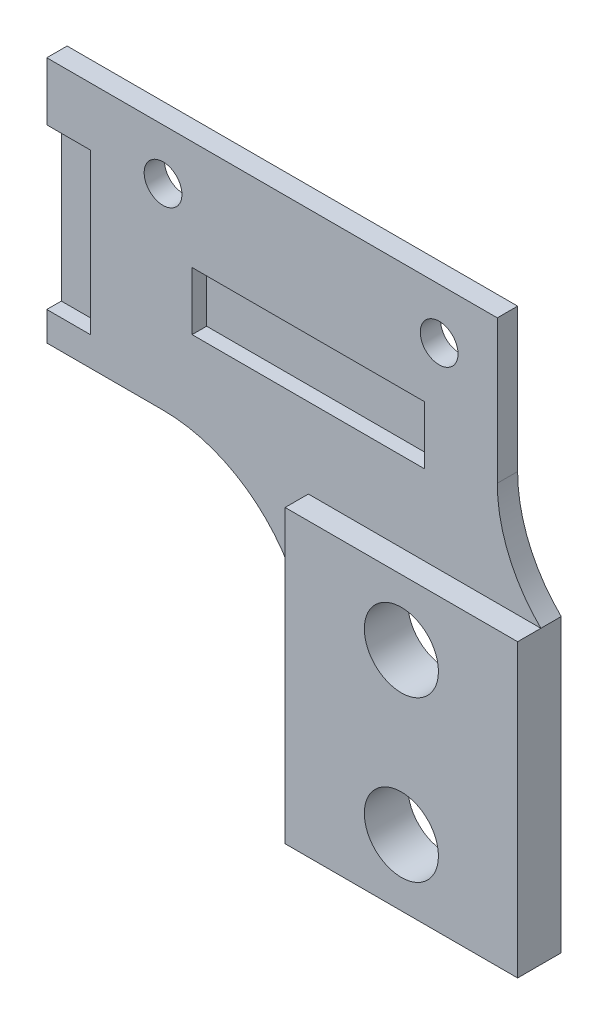
ISO-10303-21;
HEADER;
FILE_DESCRIPTION(('STEP AP214'),'2;1');
FILE_NAME('part.step','',(''),(''),'','','');
FILE_SCHEMA(('AUTOMOTIVE_DESIGN { 1 0 10303 214 1 1 1 1 }'));
ENDSEC;
DATA;
#1=APPLICATION_CONTEXT('core data for automotive mechanical design processes');
#2=APPLICATION_PROTOCOL_DEFINITION('international standard','automotive_design',2000,#1);
#3=PRODUCT_CONTEXT('',#1,'mechanical');
#4=PRODUCT('Part','Part','',(#3));
#5=PRODUCT_RELATED_PRODUCT_CATEGORY('part','',(#4));
#6=PRODUCT_DEFINITION_FORMATION('','',#4);
#7=PRODUCT_DEFINITION_CONTEXT('part definition',#1,'design');
#8=PRODUCT_DEFINITION('design','',#6,#7);
#9=PRODUCT_DEFINITION_SHAPE('','',#8);
#10=(LENGTH_UNIT() NAMED_UNIT(*) SI_UNIT(.MILLI.,.METRE.));
#11=(NAMED_UNIT(*) PLANE_ANGLE_UNIT() SI_UNIT($,.RADIAN.));
#12=(NAMED_UNIT(*) SI_UNIT($,.STERADIAN.) SOLID_ANGLE_UNIT());
#13=UNCERTAINTY_MEASURE_WITH_UNIT(LENGTH_MEASURE(1.E-05),#10,'distance_accuracy_value','');
#14=(GEOMETRIC_REPRESENTATION_CONTEXT(3) GLOBAL_UNCERTAINTY_ASSIGNED_CONTEXT((#13)) GLOBAL_UNIT_ASSIGNED_CONTEXT((#10,
#11,#12)) REPRESENTATION_CONTEXT('',''));
#15=CARTESIAN_POINT('',(0.,0.,0.));
#16=DIRECTION('',(0.,0.,1.));
#17=DIRECTION('',(1.,0.,0.));
#18=AXIS2_PLACEMENT_3D('',#15,#16,#17);
#19=CARTESIAN_POINT('',(-20.,-8.5,1.4));
#20=DIRECTION('',(0.,1.,0.));
#21=DIRECTION('',(0.,0.,1.));
#22=AXIS2_PLACEMENT_3D('',#19,#20,#21);
#23=PLANE('',#22);
#24=DIRECTION('',(1.,0.,0.));
#25=VECTOR('',#24,1.);
#26=CARTESIAN_POINT('',(-20.,-8.5,0.));
#27=LINE('',#26,#25);
#28=CARTESIAN_POINT('',(-11.,-8.5,0.));
#29=VERTEX_POINT('',#28);
#30=CARTESIAN_POINT('',(-2.99999999999997,-8.5,0.));
#31=VERTEX_POINT('',#30);
#32=EDGE_CURVE('E278',#29,#31,#27,.T.);
#33=ORIENTED_EDGE('',*,*,#32,.T.);
#34=DIRECTION('',(0.,0.,-1.));
#35=VECTOR('',#34,1.);
#36=CARTESIAN_POINT('',(-2.99999999999997,-8.5,1.4));
#37=LINE('',#36,#35);
#38=CARTESIAN_POINT('',(-2.99999999999997,-8.5,1.4));
#39=VERTEX_POINT('',#38);
#40=EDGE_CURVE('E299',#31,#39,#37,.F.);
#41=ORIENTED_EDGE('',*,*,#40,.T.);
#42=DIRECTION('',(1.,0.,0.));
#43=VECTOR('',#42,1.);
#44=CARTESIAN_POINT('',(-20.,-8.5,1.4));
#45=LINE('',#44,#43);
#46=CARTESIAN_POINT('',(-11.,-8.5,1.4));
#47=VERTEX_POINT('',#46);
#48=EDGE_CURVE('E282',#47,#39,#45,.T.);
#49=ORIENTED_EDGE('',*,*,#48,.F.);
#50=DIRECTION('',(0.,0.,-1.));
#51=VECTOR('',#50,1.);
#52=CARTESIAN_POINT('',(-11.,-8.5,21.));
#53=LINE('',#52,#51);
#54=EDGE_CURVE('E194',#47,#29,#53,.T.);
#55=ORIENTED_EDGE('',*,*,#54,.T.);
#56=EDGE_LOOP('',(#33,#41,#49,#55));
#57=FACE_BOUND('',#56,.T.);
#58=ADVANCED_FACE('F32',(#57),#23,.F.);
#59=CARTESIAN_POINT('',(-20.,8.5,1.4));
#60=DIRECTION('',(0.,-1.,0.));
#61=DIRECTION('',(0.,0.,-1.));
#62=AXIS2_PLACEMENT_3D('',#59,#60,#61);
#63=PLANE('',#62);
#64=DIRECTION('',(0.,0.,-1.));
#65=VECTOR('',#64,1.);
#66=CARTESIAN_POINT('',(-11.,8.5,21.));
#67=LINE('',#66,#65);
#68=CARTESIAN_POINT('',(-11.,8.5,1.4));
#69=VERTEX_POINT('',#68);
#70=CARTESIAN_POINT('',(-11.,8.5,0.));
#71=VERTEX_POINT('',#70);
#72=EDGE_CURVE('E187',#69,#71,#67,.T.);
#73=ORIENTED_EDGE('',*,*,#72,.F.);
#74=DIRECTION('',(-1.,0.,0.));
#75=VECTOR('',#74,1.);
#76=CARTESIAN_POINT('',(-20.,8.5,1.4));
#77=LINE('',#76,#75);
#78=CARTESIAN_POINT('',(20.,8.5,1.4));
#79=VERTEX_POINT('',#78);
#80=EDGE_CURVE('E277',#79,#69,#77,.T.);
#81=ORIENTED_EDGE('',*,*,#80,.F.);
#82=DIRECTION('',(0.,0.,-1.));
#83=VECTOR('',#82,1.);
#84=CARTESIAN_POINT('',(20.,8.5,1.4));
#85=LINE('',#84,#83);
#86=CARTESIAN_POINT('',(20.,8.5,0.));
#87=VERTEX_POINT('',#86);
#88=EDGE_CURVE('E285',#79,#87,#85,.T.);
#89=ORIENTED_EDGE('',*,*,#88,.T.);
#90=DIRECTION('',(-1.,0.,0.));
#91=VECTOR('',#90,1.);
#92=CARTESIAN_POINT('',(-20.,8.5,0.));
#93=LINE('',#92,#91);
#94=EDGE_CURVE('E287',#87,#71,#93,.T.);
#95=ORIENTED_EDGE('',*,*,#94,.T.);
#96=EDGE_LOOP('',(#73,#81,#89,#95));
#97=FACE_BOUND('',#96,.T.);
#98=ADVANCED_FACE('F372',(#97),#63,.F.);
#99=CARTESIAN_POINT('',(0.,0.,1.4));
#100=DIRECTION('',(0.,0.,-1.));
#101=DIRECTION('',(-1.,0.,0.));
#102=AXIS2_PLACEMENT_3D('',#99,#100,#101);
#103=PLANE('',#102);
#104=DIRECTION('',(0.,-1.,0.));
#105=VECTOR('',#104,1.);
#106=CARTESIAN_POINT('',(-0.999999999999977,0.,1.4));
#107=LINE('',#106,#105);
#108=CARTESIAN_POINT('',(-0.999999999999977,0.999999999999996,1.4));
#109=VERTEX_POINT('',#108);
#110=CARTESIAN_POINT('',(-0.999999999999977,-3.,1.4));
#111=VERTEX_POINT('',#110);
#112=EDGE_CURVE('E229',#109,#111,#107,.T.);
#113=ORIENTED_EDGE('',*,*,#112,.F.);
#114=DIRECTION('',(-1.,0.,0.));
#115=VECTOR('',#114,1.);
#116=CARTESIAN_POINT('',(0.,0.999999999999996,1.4));
#117=LINE('',#116,#115);
#118=CARTESIAN_POINT('',(15.,0.999999999999996,1.4));
#119=VERTEX_POINT('',#118);
#120=EDGE_CURVE('E227',#119,#109,#117,.T.);
#121=ORIENTED_EDGE('',*,*,#120,.F.);
#122=DIRECTION('',(0.,1.,0.));
#123=VECTOR('',#122,1.);
#124=CARTESIAN_POINT('',(15.,0.,1.4));
#125=LINE('',#124,#123);
#126=CARTESIAN_POINT('',(15.,-3.,1.4));
#127=VERTEX_POINT('',#126);
#128=EDGE_CURVE('E217',#127,#119,#125,.T.);
#129=ORIENTED_EDGE('',*,*,#128,.F.);
#130=DIRECTION('',(1.,0.,0.));
#131=VECTOR('',#130,1.);
#132=CARTESIAN_POINT('',(0.,-3.,1.4));
#133=LINE('',#132,#131);
#134=EDGE_CURVE('E233',#111,#127,#133,.T.);
#135=ORIENTED_EDGE('',*,*,#134,.F.);
#136=EDGE_LOOP('',(#113,#121,#129,#135));
#137=FACE_BOUND('',#136,.T.);
#138=CARTESIAN_POINT('',(-2.99999999999997,5.,1.4));
#139=DIRECTION('',(0.,0.,-1.));
#140=DIRECTION('',(-1.,0.,0.));
#141=AXIS2_PLACEMENT_3D('',#138,#139,#140);
#142=CIRCLE('',#141,1.3);
#143=CARTESIAN_POINT('',(-4.29999999999997,5.,1.4));
#144=VERTEX_POINT('',#143);
#145=EDGE_CURVE('E203',#144,#144,#142,.F.);
#146=ORIENTED_EDGE('',*,*,#145,.F.);
#147=EDGE_LOOP('',(#146));
#148=FACE_BOUND('',#147,.T.);
#149=CARTESIAN_POINT('',(16.,5.,1.4));
#150=DIRECTION('',(0.,0.,-1.));
#151=DIRECTION('',(-1.,0.,0.));
#152=AXIS2_PLACEMENT_3D('',#149,#150,#151);
#153=CIRCLE('',#152,1.3);
#154=CARTESIAN_POINT('',(14.7,5.,1.4));
#155=VERTEX_POINT('',#154);
#156=EDGE_CURVE('E209',#155,#155,#153,.F.);
#157=ORIENTED_EDGE('',*,*,#156,.F.);
#158=EDGE_LOOP('',(#157));
#159=FACE_BOUND('',#158,.T.);
#160=DIRECTION('',(0.,1.,0.));
#161=VECTOR('',#160,1.);
#162=CARTESIAN_POINT('',(-11.,0.,1.4));
#163=LINE('',#162,#161);
#164=CARTESIAN_POINT('',(-11.,-6.5,1.4));
#165=VERTEX_POINT('',#164);
#166=EDGE_CURVE('E199',#47,#165,#163,.T.);
#167=ORIENTED_EDGE('',*,*,#166,.F.);
#168=ORIENTED_EDGE('',*,*,#48,.T.);
#169=CARTESIAN_POINT('',(-2.99999999999997,-18.5,1.4));
#170=DIRECTION('',(0.,0.,-1.));
#171=DIRECTION('',(-1.,0.,0.));
#172=AXIS2_PLACEMENT_3D('',#169,#170,#171);
#173=CIRCLE('',#172,10.);
#174=CARTESIAN_POINT('',(7.00000000000003,-18.5,1.4));
#175=VERTEX_POINT('',#174);
#176=EDGE_CURVE('E11',#39,#175,#173,.T.);
#177=ORIENTED_EDGE('',*,*,#176,.T.);
#178=DIRECTION('',(0.,-1.,0.));
#179=VECTOR('',#178,1.);
#180=CARTESIAN_POINT('',(7.00000000000003,0.,1.4));
#181=LINE('',#180,#179);
#182=CARTESIAN_POINT('',(7.00000000000003,-8.5,1.4));
#183=VERTEX_POINT('',#182);
#184=EDGE_CURVE('E46',#183,#175,#181,.T.);
#185=ORIENTED_EDGE('',*,*,#184,.F.);
#186=CARTESIAN_POINT('',(23.,-8.5,1.4));
#187=VERTEX_POINT('',#186);
#188=EDGE_CURVE('E281',#183,#187,#45,.T.);
#189=ORIENTED_EDGE('',*,*,#188,.T.);
#190=CARTESIAN_POINT('',(30.,-1.35857157145716,1.4));
#191=DIRECTION('',(0.,0.,-1.));
#192=DIRECTION('',(-1.,0.,0.));
#193=AXIS2_PLACEMENT_3D('',#190,#191,#192);
#194=CIRCLE('',#193,10.);
#195=CARTESIAN_POINT('',(20.,-1.35857157145716,1.4));
#196=VERTEX_POINT('',#195);
#197=EDGE_CURVE('E303',#187,#196,#194,.T.);
#198=ORIENTED_EDGE('',*,*,#197,.T.);
#199=DIRECTION('',(0.,1.,0.));
#200=VECTOR('',#199,1.);
#201=CARTESIAN_POINT('',(20.,-8.5,1.4));
#202=LINE('',#201,#200);
#203=EDGE_CURVE('E275',#196,#79,#202,.T.);
#204=ORIENTED_EDGE('',*,*,#203,.T.);
#205=ORIENTED_EDGE('',*,*,#80,.T.);
#206=CARTESIAN_POINT('',(-11.,4.5,1.4));
#207=VERTEX_POINT('',#206);
#208=EDGE_CURVE('E197',#207,#69,#163,.T.);
#209=ORIENTED_EDGE('',*,*,#208,.F.);
#210=DIRECTION('',(-1.,0.,0.));
#211=VECTOR('',#210,1.);
#212=CARTESIAN_POINT('',(0.,4.5,1.4));
#213=LINE('',#212,#211);
#214=CARTESIAN_POINT('',(-7.99999999999998,4.5,1.4));
#215=VERTEX_POINT('',#214);
#216=EDGE_CURVE('E262',#215,#207,#213,.T.);
#217=ORIENTED_EDGE('',*,*,#216,.F.);
#218=DIRECTION('',(0.,1.,0.));
#219=VECTOR('',#218,1.);
#220=CARTESIAN_POINT('',(-7.99999999999998,0.,1.4));
#221=LINE('',#220,#219);
#222=CARTESIAN_POINT('',(-7.99999999999998,-6.5,1.4));
#223=VERTEX_POINT('',#222);
#224=EDGE_CURVE('E212',#223,#215,#221,.T.);
#225=ORIENTED_EDGE('',*,*,#224,.F.);
#226=DIRECTION('',(1.,0.,0.));
#227=VECTOR('',#226,1.);
#228=CARTESIAN_POINT('',(0.,-6.5,1.4));
#229=LINE('',#228,#227);
#230=EDGE_CURVE('E251',#165,#223,#229,.T.);
#231=ORIENTED_EDGE('',*,*,#230,.F.);
#232=EDGE_LOOP('',(#167,#168,#177,#185,#189,#198,#204,#205,#209,#217,#225,#231));
#233=FACE_BOUND('',#232,.T.);
#234=ADVANCED_FACE('F307',(#137,#148,#159,#233),#103,.F.);
#235=CARTESIAN_POINT('',(0.,0.,0.));
#236=DIRECTION('',(0.,0.,-1.));
#237=DIRECTION('',(-1.,0.,0.));
#238=AXIS2_PLACEMENT_3D('',#235,#236,#237);
#239=PLANE('',#238);
#240=CARTESIAN_POINT('',(16.,5.,0.));
#241=DIRECTION('',(0.,0.,1.));
#242=DIRECTION('',(1.,0.,0.));
#243=AXIS2_PLACEMENT_3D('',#240,#241,#242);
#244=CIRCLE('',#243,1.3);
#245=CARTESIAN_POINT('',(17.3,5.,0.));
#246=VERTEX_POINT('',#245);
#247=EDGE_CURVE('E200',#246,#246,#244,.T.);
#248=ORIENTED_EDGE('',*,*,#247,.T.);
#249=EDGE_LOOP('',(#248));
#250=FACE_BOUND('',#249,.T.);
#251=CARTESIAN_POINT('',(-2.99999999999997,5.,0.));
#252=DIRECTION('',(0.,0.,1.));
#253=DIRECTION('',(1.,0.,0.));
#254=AXIS2_PLACEMENT_3D('',#251,#252,#253);
#255=CIRCLE('',#254,1.3);
#256=CARTESIAN_POINT('',(-1.69999999999997,5.,0.));
#257=VERTEX_POINT('',#256);
#258=EDGE_CURVE('E204',#257,#257,#255,.T.);
#259=ORIENTED_EDGE('',*,*,#258,.T.);
#260=EDGE_LOOP('',(#259));
#261=FACE_BOUND('',#260,.T.);
#262=ORIENTED_EDGE('',*,*,#32,.F.);
#263=DIRECTION('',(0.,1.,0.));
#264=VECTOR('',#263,1.);
#265=CARTESIAN_POINT('',(-11.,8.5,0.));
#266=LINE('',#265,#264);
#267=EDGE_CURVE('E184',#29,#71,#266,.T.);
#268=ORIENTED_EDGE('',*,*,#267,.T.);
#269=ORIENTED_EDGE('',*,*,#94,.F.);
#270=DIRECTION('',(0.,1.,0.));
#271=VECTOR('',#270,1.);
#272=CARTESIAN_POINT('',(20.,-8.5,0.));
#273=LINE('',#272,#271);
#274=CARTESIAN_POINT('',(20.,-1.35857157145716,0.));
#275=VERTEX_POINT('',#274);
#276=EDGE_CURVE('E240',#275,#87,#273,.T.);
#277=ORIENTED_EDGE('',*,*,#276,.F.);
#278=CARTESIAN_POINT('',(30.,-1.35857157145716,0.));
#279=DIRECTION('',(0.,0.,-1.));
#280=DIRECTION('',(-1.,0.,0.));
#281=AXIS2_PLACEMENT_3D('',#278,#279,#280);
#282=CIRCLE('',#281,10.);
#283=CARTESIAN_POINT('',(23.,-8.5,0.));
#284=VERTEX_POINT('',#283);
#285=EDGE_CURVE('E301',#275,#284,#282,.F.);
#286=ORIENTED_EDGE('',*,*,#285,.T.);
#287=DIRECTION('',(0.,1.,0.));
#288=VECTOR('',#287,1.);
#289=CARTESIAN_POINT('',(23.,-8.5,0.));
#290=LINE('',#289,#288);
#291=CARTESIAN_POINT('',(23.,-28.5414440640029,0.));
#292=VERTEX_POINT('',#291);
#293=EDGE_CURVE('E178',#292,#284,#290,.T.);
#294=ORIENTED_EDGE('',*,*,#293,.F.);
#295=DIRECTION('',(1.,0.,0.));
#296=VECTOR('',#295,1.);
#297=CARTESIAN_POINT('',(23.,-28.5414440640029,0.));
#298=LINE('',#297,#296);
#299=CARTESIAN_POINT('',(7.00000000000003,-28.5414440640029,0.));
#300=VERTEX_POINT('',#299);
#301=EDGE_CURVE('E329',#300,#292,#298,.T.);
#302=ORIENTED_EDGE('',*,*,#301,.F.);
#303=DIRECTION('',(0.,-1.,0.));
#304=VECTOR('',#303,1.);
#305=CARTESIAN_POINT('',(7.00000000000003,-8.49999999999999,0.));
#306=LINE('',#305,#304);
#307=CARTESIAN_POINT('',(7.00000000000003,-18.5,0.));
#308=VERTEX_POINT('',#307);
#309=EDGE_CURVE('E182',#308,#300,#306,.T.);
#310=ORIENTED_EDGE('',*,*,#309,.F.);
#311=CARTESIAN_POINT('',(-2.99999999999997,-18.5,0.));
#312=DIRECTION('',(0.,0.,-1.));
#313=DIRECTION('',(-1.,0.,0.));
#314=AXIS2_PLACEMENT_3D('',#311,#312,#313);
#315=CIRCLE('',#314,10.);
#316=EDGE_CURVE('E40',#308,#31,#315,.F.);
#317=ORIENTED_EDGE('',*,*,#316,.T.);
#318=EDGE_LOOP('',(#262,#268,#269,#277,#286,#294,#302,#310,#317));
#319=FACE_BOUND('',#318,.T.);
#320=CARTESIAN_POINT('',(15.,-13.,0.));
#321=DIRECTION('',(0.,0.,1.));
#322=DIRECTION('',(1.,0.,0.));
#323=AXIS2_PLACEMENT_3D('',#320,#321,#322);
#324=CIRCLE('',#323,2.55);
#325=CARTESIAN_POINT('',(17.55,-13.,0.));
#326=VERTEX_POINT('',#325);
#327=EDGE_CURVE('E341',#326,#326,#324,.T.);
#328=ORIENTED_EDGE('',*,*,#327,.T.);
#329=EDGE_LOOP('',(#328));
#330=FACE_BOUND('',#329,.T.);
#331=CARTESIAN_POINT('',(15.,-24.,0.));
#332=DIRECTION('',(0.,0.,1.));
#333=DIRECTION('',(1.,0.,0.));
#334=AXIS2_PLACEMENT_3D('',#331,#332,#333);
#335=CIRCLE('',#334,2.55);
#336=CARTESIAN_POINT('',(17.55,-24.,0.));
#337=VERTEX_POINT('',#336);
#338=EDGE_CURVE('E349',#337,#337,#335,.T.);
#339=ORIENTED_EDGE('',*,*,#338,.T.);
#340=EDGE_LOOP('',(#339));
#341=FACE_BOUND('',#340,.T.);
#342=ADVANCED_FACE('F322',(#250,#261,#319,#330,#341),#239,.T.);
#343=CARTESIAN_POINT('',(20.,-8.5,1.4));
#344=DIRECTION('',(-1.,0.,0.));
#345=DIRECTION('',(0.,0.,1.));
#346=AXIS2_PLACEMENT_3D('',#343,#344,#345);
#347=PLANE('',#346);
#348=ORIENTED_EDGE('',*,*,#203,.F.);
#349=DIRECTION('',(0.,0.,-1.));
#350=VECTOR('',#349,1.);
#351=CARTESIAN_POINT('',(20.,-1.35857157145716,1.4));
#352=LINE('',#351,#350);
#353=EDGE_CURVE('E293',#196,#275,#352,.T.);
#354=ORIENTED_EDGE('',*,*,#353,.T.);
#355=ORIENTED_EDGE('',*,*,#276,.T.);
#356=ORIENTED_EDGE('',*,*,#88,.F.);
#357=EDGE_LOOP('',(#348,#354,#355,#356));
#358=FACE_BOUND('',#357,.T.);
#359=ADVANCED_FACE('F316',(#358),#347,.F.);
#360=CARTESIAN_POINT('',(-7.99999999999998,0.,0.4));
#361=DIRECTION('',(1.,0.,0.));
#362=DIRECTION('',(0.,0.,-1.));
#363=AXIS2_PLACEMENT_3D('',#360,#361,#362);
#364=PLANE('',#363);
#365=ORIENTED_EDGE('',*,*,#224,.T.);
#366=DIRECTION('',(0.,0.,1.));
#367=VECTOR('',#366,1.);
#368=CARTESIAN_POINT('',(-7.99999999999998,4.5,0.4));
#369=LINE('',#368,#367);
#370=CARTESIAN_POINT('',(-7.99999999999998,4.5,0.4));
#371=VERTEX_POINT('',#370);
#372=EDGE_CURVE('E260',#371,#215,#369,.T.);
#373=ORIENTED_EDGE('',*,*,#372,.F.);
#374=DIRECTION('',(0.,1.,0.));
#375=VECTOR('',#374,1.);
#376=CARTESIAN_POINT('',(-7.99999999999998,0.,0.4));
#377=LINE('',#376,#375);
#378=CARTESIAN_POINT('',(-7.99999999999998,-6.5,0.4));
#379=VERTEX_POINT('',#378);
#380=EDGE_CURVE('E247',#379,#371,#377,.T.);
#381=ORIENTED_EDGE('',*,*,#380,.F.);
#382=DIRECTION('',(0.,0.,1.));
#383=VECTOR('',#382,1.);
#384=CARTESIAN_POINT('',(-7.99999999999998,-6.5,0.4));
#385=LINE('',#384,#383);
#386=EDGE_CURVE('E230',#379,#223,#385,.T.);
#387=ORIENTED_EDGE('',*,*,#386,.T.);
#388=EDGE_LOOP('',(#365,#373,#381,#387));
#389=FACE_BOUND('',#388,.T.);
#390=ADVANCED_FACE('F384',(#389),#364,.F.);
#391=CARTESIAN_POINT('',(0.,-6.5,0.4));
#392=DIRECTION('',(0.,-1.,0.));
#393=DIRECTION('',(0.,0.,-1.));
#394=AXIS2_PLACEMENT_3D('',#391,#392,#393);
#395=PLANE('',#394);
#396=ORIENTED_EDGE('',*,*,#230,.T.);
#397=ORIENTED_EDGE('',*,*,#386,.F.);
#398=DIRECTION('',(1.,0.,0.));
#399=VECTOR('',#398,1.);
#400=CARTESIAN_POINT('',(0.,-6.5,0.4));
#401=LINE('',#400,#399);
#402=CARTESIAN_POINT('',(-11.,-6.5,0.4));
#403=VERTEX_POINT('',#402);
#404=EDGE_CURVE('E257',#403,#379,#401,.T.);
#405=ORIENTED_EDGE('',*,*,#404,.F.);
#406=DIRECTION('',(0.,0.,1.));
#407=VECTOR('',#406,1.);
#408=CARTESIAN_POINT('',(-11.,-6.5,0.4));
#409=LINE('',#408,#407);
#410=EDGE_CURVE('E268',#403,#165,#409,.T.);
#411=ORIENTED_EDGE('',*,*,#410,.T.);
#412=EDGE_LOOP('',(#396,#397,#405,#411));
#413=FACE_BOUND('',#412,.T.);
#414=ADVANCED_FACE('F453',(#413),#395,.F.);
#415=CARTESIAN_POINT('',(0.,4.5,0.4));
#416=DIRECTION('',(0.,1.,0.));
#417=DIRECTION('',(0.,0.,1.));
#418=AXIS2_PLACEMENT_3D('',#415,#416,#417);
#419=PLANE('',#418);
#420=ORIENTED_EDGE('',*,*,#216,.T.);
#421=DIRECTION('',(0.,0.,1.));
#422=VECTOR('',#421,1.);
#423=CARTESIAN_POINT('',(-11.,4.5,0.4));
#424=LINE('',#423,#422);
#425=CARTESIAN_POINT('',(-11.,4.5,0.4));
#426=VERTEX_POINT('',#425);
#427=EDGE_CURVE('E271',#426,#207,#424,.T.);
#428=ORIENTED_EDGE('',*,*,#427,.F.);
#429=DIRECTION('',(-1.,0.,0.));
#430=VECTOR('',#429,1.);
#431=CARTESIAN_POINT('',(0.,4.5,0.4));
#432=LINE('',#431,#430);
#433=EDGE_CURVE('E250',#371,#426,#432,.T.);
#434=ORIENTED_EDGE('',*,*,#433,.F.);
#435=ORIENTED_EDGE('',*,*,#372,.T.);
#436=EDGE_LOOP('',(#420,#428,#434,#435));
#437=FACE_BOUND('',#436,.T.);
#438=ADVANCED_FACE('F451',(#437),#419,.F.);
#439=CARTESIAN_POINT('',(0.,0.,0.4));
#440=DIRECTION('',(0.,0.,1.));
#441=DIRECTION('',(1.,0.,0.));
#442=AXIS2_PLACEMENT_3D('',#439,#440,#441);
#443=PLANE('',#442);
#444=ORIENTED_EDGE('',*,*,#380,.T.);
#445=ORIENTED_EDGE('',*,*,#433,.T.);
#446=DIRECTION('',(0.,-1.,0.));
#447=VECTOR('',#446,1.);
#448=CARTESIAN_POINT('',(-11.,0.,0.4));
#449=LINE('',#448,#447);
#450=EDGE_CURVE('E254',#426,#403,#449,.T.);
#451=ORIENTED_EDGE('',*,*,#450,.T.);
#452=ORIENTED_EDGE('',*,*,#404,.T.);
#453=EDGE_LOOP('',(#444,#445,#451,#452));
#454=FACE_BOUND('',#453,.T.);
#455=ADVANCED_FACE('F447',(#454),#443,.T.);
#456=CARTESIAN_POINT('',(0.,0.999999999999996,0.4));
#457=DIRECTION('',(0.,1.,0.));
#458=DIRECTION('',(0.,0.,1.));
#459=AXIS2_PLACEMENT_3D('',#456,#457,#458);
#460=PLANE('',#459);
#461=ORIENTED_EDGE('',*,*,#120,.T.);
#462=DIRECTION('',(0.,0.,1.));
#463=VECTOR('',#462,1.);
#464=CARTESIAN_POINT('',(-0.999999999999977,0.999999999999996,0.4));
#465=LINE('',#464,#463);
#466=CARTESIAN_POINT('',(-0.999999999999977,0.999999999999996,0.4));
#467=VERTEX_POINT('',#466);
#468=EDGE_CURVE('E226',#467,#109,#465,.T.);
#469=ORIENTED_EDGE('',*,*,#468,.F.);
#470=DIRECTION('',(-1.,0.,0.));
#471=VECTOR('',#470,1.);
#472=CARTESIAN_POINT('',(0.,0.999999999999996,0.4));
#473=LINE('',#472,#471);
#474=CARTESIAN_POINT('',(15.,0.999999999999996,0.4));
#475=VERTEX_POINT('',#474);
#476=EDGE_CURVE('E213',#475,#467,#473,.T.);
#477=ORIENTED_EDGE('',*,*,#476,.F.);
#478=DIRECTION('',(0.,0.,1.));
#479=VECTOR('',#478,1.);
#480=CARTESIAN_POINT('',(15.,0.999999999999996,0.4));
#481=LINE('',#480,#479);
#482=EDGE_CURVE('E238',#475,#119,#481,.T.);
#483=ORIENTED_EDGE('',*,*,#482,.T.);
#484=EDGE_LOOP('',(#461,#469,#477,#483));
#485=FACE_BOUND('',#484,.T.);
#486=ADVANCED_FACE('F437',(#485),#460,.F.);
#487=CARTESIAN_POINT('',(15.,0.,0.4));
#488=DIRECTION('',(1.,0.,0.));
#489=DIRECTION('',(0.,0.,-1.));
#490=AXIS2_PLACEMENT_3D('',#487,#488,#489);
#491=PLANE('',#490);
#492=ORIENTED_EDGE('',*,*,#128,.T.);
#493=ORIENTED_EDGE('',*,*,#482,.F.);
#494=DIRECTION('',(0.,1.,0.));
#495=VECTOR('',#494,1.);
#496=CARTESIAN_POINT('',(15.,0.,0.4));
#497=LINE('',#496,#495);
#498=CARTESIAN_POINT('',(15.,-3.,0.4));
#499=VERTEX_POINT('',#498);
#500=EDGE_CURVE('E223',#499,#475,#497,.T.);
#501=ORIENTED_EDGE('',*,*,#500,.F.);
#502=DIRECTION('',(0.,0.,1.));
#503=VECTOR('',#502,1.);
#504=CARTESIAN_POINT('',(15.,-3.,0.4));
#505=LINE('',#504,#503);
#506=EDGE_CURVE('E241',#499,#127,#505,.T.);
#507=ORIENTED_EDGE('',*,*,#506,.T.);
#508=EDGE_LOOP('',(#492,#493,#501,#507));
#509=FACE_BOUND('',#508,.T.);
#510=ADVANCED_FACE('F433',(#509),#491,.F.);
#511=CARTESIAN_POINT('',(0.,-3.,0.4));
#512=DIRECTION('',(0.,-1.,0.));
#513=DIRECTION('',(0.,0.,-1.));
#514=AXIS2_PLACEMENT_3D('',#511,#512,#513);
#515=PLANE('',#514);
#516=ORIENTED_EDGE('',*,*,#134,.T.);
#517=ORIENTED_EDGE('',*,*,#506,.F.);
#518=DIRECTION('',(1.,0.,0.));
#519=VECTOR('',#518,1.);
#520=CARTESIAN_POINT('',(0.,-3.,0.4));
#521=LINE('',#520,#519);
#522=CARTESIAN_POINT('',(-0.999999999999977,-3.,0.4));
#523=VERTEX_POINT('',#522);
#524=EDGE_CURVE('E220',#523,#499,#521,.T.);
#525=ORIENTED_EDGE('',*,*,#524,.F.);
#526=DIRECTION('',(0.,0.,1.));
#527=VECTOR('',#526,1.);
#528=CARTESIAN_POINT('',(-0.999999999999977,-3.,0.4));
#529=LINE('',#528,#527);
#530=EDGE_CURVE('E243',#523,#111,#529,.T.);
#531=ORIENTED_EDGE('',*,*,#530,.T.);
#532=EDGE_LOOP('',(#516,#517,#525,#531));
#533=FACE_BOUND('',#532,.T.);
#534=ADVANCED_FACE('F436',(#533),#515,.F.);
#535=CARTESIAN_POINT('',(-0.999999999999977,0.,0.4));
#536=DIRECTION('',(-1.,0.,0.));
#537=DIRECTION('',(0.,-1.,0.));
#538=AXIS2_PLACEMENT_3D('',#535,#536,#537);
#539=PLANE('',#538);
#540=ORIENTED_EDGE('',*,*,#112,.T.);
#541=ORIENTED_EDGE('',*,*,#530,.F.);
#542=DIRECTION('',(0.,-1.,0.));
#543=VECTOR('',#542,1.);
#544=CARTESIAN_POINT('',(-0.999999999999977,0.,0.4));
#545=LINE('',#544,#543);
#546=EDGE_CURVE('E216',#467,#523,#545,.T.);
#547=ORIENTED_EDGE('',*,*,#546,.F.);
#548=ORIENTED_EDGE('',*,*,#468,.T.);
#549=EDGE_LOOP('',(#540,#541,#547,#548));
#550=FACE_BOUND('',#549,.T.);
#551=ADVANCED_FACE('F431',(#550),#539,.F.);
#552=CARTESIAN_POINT('',(0.,0.,0.4));
#553=DIRECTION('',(0.,0.,1.));
#554=DIRECTION('',(1.,0.,0.));
#555=AXIS2_PLACEMENT_3D('',#552,#553,#554);
#556=PLANE('',#555);
#557=ORIENTED_EDGE('',*,*,#476,.T.);
#558=ORIENTED_EDGE('',*,*,#546,.T.);
#559=ORIENTED_EDGE('',*,*,#524,.T.);
#560=ORIENTED_EDGE('',*,*,#500,.T.);
#561=EDGE_LOOP('',(#557,#558,#559,#560));
#562=FACE_BOUND('',#561,.T.);
#563=ADVANCED_FACE('F416',(#562),#556,.T.);
#564=CARTESIAN_POINT('',(-2.99999999999997,5.,11.));
#565=DIRECTION('',(0.,0.,-1.));
#566=DIRECTION('',(-1.,0.,0.));
#567=AXIS2_PLACEMENT_3D('',#564,#565,#566);
#568=CYLINDRICAL_SURFACE('',#567,1.3);
#569=ORIENTED_EDGE('',*,*,#258,.F.);
#570=EDGE_LOOP('',(#569));
#571=FACE_BOUND('',#570,.T.);
#572=ORIENTED_EDGE('',*,*,#145,.T.);
#573=EDGE_LOOP('',(#572));
#574=FACE_BOUND('',#573,.T.);
#575=ADVANCED_FACE('F413',(#571,#574),#568,.F.);
#576=CARTESIAN_POINT('',(16.,5.,11.));
#577=DIRECTION('',(0.,0.,-1.));
#578=DIRECTION('',(-1.,0.,0.));
#579=AXIS2_PLACEMENT_3D('',#576,#577,#578);
#580=CYLINDRICAL_SURFACE('',#579,1.3);
#581=ORIENTED_EDGE('',*,*,#247,.F.);
#582=EDGE_LOOP('',(#581));
#583=FACE_BOUND('',#582,.T.);
#584=ORIENTED_EDGE('',*,*,#156,.T.);
#585=EDGE_LOOP('',(#584));
#586=FACE_BOUND('',#585,.T.);
#587=ADVANCED_FACE('F366',(#583,#586),#580,.F.);
#588=CARTESIAN_POINT('',(-11.,8.5,21.));
#589=DIRECTION('',(-1.,0.,0.));
#590=DIRECTION('',(0.,0.,1.));
#591=AXIS2_PLACEMENT_3D('',#588,#589,#590);
#592=PLANE('',#591);
#593=ORIENTED_EDGE('',*,*,#166,.T.);
#594=ORIENTED_EDGE('',*,*,#410,.F.);
#595=ORIENTED_EDGE('',*,*,#450,.F.);
#596=ORIENTED_EDGE('',*,*,#427,.T.);
#597=ORIENTED_EDGE('',*,*,#208,.T.);
#598=ORIENTED_EDGE('',*,*,#72,.T.);
#599=ORIENTED_EDGE('',*,*,#267,.F.);
#600=ORIENTED_EDGE('',*,*,#54,.F.);
#601=EDGE_LOOP('',(#593,#594,#595,#596,#597,#598,#599,#600));
#602=FACE_BOUND('',#601,.T.);
#603=ADVANCED_FACE('F359',(#602),#592,.T.);
#604=CARTESIAN_POINT('',(0.,0.,3.));
#605=DIRECTION('',(0.,0.,-1.));
#606=DIRECTION('',(-1.,0.,0.));
#607=AXIS2_PLACEMENT_3D('',#604,#605,#606);
#608=PLANE('',#607);
#609=DIRECTION('',(0.,-1.,0.));
#610=VECTOR('',#609,1.);
#611=CARTESIAN_POINT('',(7.00000000000003,-8.49999999999999,3.));
#612=LINE('',#611,#610);
#613=CARTESIAN_POINT('',(7.00000000000003,-8.49999999999999,3.));
#614=VERTEX_POINT('',#613);
#615=CARTESIAN_POINT('',(7.00000000000003,-28.5414440640029,3.));
#616=VERTEX_POINT('',#615);
#617=EDGE_CURVE('E169',#614,#616,#612,.T.);
#618=ORIENTED_EDGE('',*,*,#617,.T.);
#619=DIRECTION('',(1.,0.,0.));
#620=VECTOR('',#619,1.);
#621=CARTESIAN_POINT('',(23.,-28.5414440640029,3.));
#622=LINE('',#621,#620);
#623=CARTESIAN_POINT('',(23.,-28.5414440640029,3.));
#624=VERTEX_POINT('',#623);
#625=EDGE_CURVE('E159',#616,#624,#622,.T.);
#626=ORIENTED_EDGE('',*,*,#625,.T.);
#627=DIRECTION('',(0.,1.,0.));
#628=VECTOR('',#627,1.);
#629=CARTESIAN_POINT('',(23.,-8.5,3.));
#630=LINE('',#629,#628);
#631=CARTESIAN_POINT('',(23.,-8.5,3.));
#632=VERTEX_POINT('',#631);
#633=EDGE_CURVE('E168',#624,#632,#630,.T.);
#634=ORIENTED_EDGE('',*,*,#633,.T.);
#635=DIRECTION('',(-1.,0.,0.));
#636=VECTOR('',#635,1.);
#637=CARTESIAN_POINT('',(23.,-8.5,3.));
#638=LINE('',#637,#636);
#639=EDGE_CURVE('E175',#632,#614,#638,.T.);
#640=ORIENTED_EDGE('',*,*,#639,.T.);
#641=EDGE_LOOP('',(#618,#626,#634,#640));
#642=FACE_BOUND('',#641,.T.);
#643=CARTESIAN_POINT('',(15.,-13.,3.));
#644=DIRECTION('',(0.,0.,1.));
#645=DIRECTION('',(1.,0.,0.));
#646=AXIS2_PLACEMENT_3D('',#643,#644,#645);
#647=CIRCLE('',#646,2.55);
#648=CARTESIAN_POINT('',(17.55,-13.,3.));
#649=VERTEX_POINT('',#648);
#650=EDGE_CURVE('E339',#649,#649,#647,.T.);
#651=ORIENTED_EDGE('',*,*,#650,.F.);
#652=EDGE_LOOP('',(#651));
#653=FACE_BOUND('',#652,.T.);
#654=CARTESIAN_POINT('',(15.,-24.,3.));
#655=DIRECTION('',(0.,0.,1.));
#656=DIRECTION('',(1.,0.,0.));
#657=AXIS2_PLACEMENT_3D('',#654,#655,#656);
#658=CIRCLE('',#657,2.55);
#659=CARTESIAN_POINT('',(17.55,-24.,3.));
#660=VERTEX_POINT('',#659);
#661=EDGE_CURVE('E346',#660,#660,#658,.T.);
#662=ORIENTED_EDGE('',*,*,#661,.F.);
#663=EDGE_LOOP('',(#662));
#664=FACE_BOUND('',#663,.T.);
#665=ADVANCED_FACE('F172',(#642,#653,#664),#608,.F.);
#666=CARTESIAN_POINT('',(7.00000000000003,-8.49999999999999,3.));
#667=DIRECTION('',(1.,0.,0.));
#668=DIRECTION('',(0.,1.,0.));
#669=AXIS2_PLACEMENT_3D('',#666,#667,#668);
#670=PLANE('',#669);
#671=ORIENTED_EDGE('',*,*,#184,.T.);
#672=DIRECTION('',(0.,0.,-1.));
#673=VECTOR('',#672,1.);
#674=CARTESIAN_POINT('',(7.00000000000003,-18.5,0.));
#675=LINE('',#674,#673);
#676=EDGE_CURVE('E297',#175,#308,#675,.T.);
#677=ORIENTED_EDGE('',*,*,#676,.T.);
#678=ORIENTED_EDGE('',*,*,#309,.T.);
#679=DIRECTION('',(0.,0.,-1.));
#680=VECTOR('',#679,1.);
#681=CARTESIAN_POINT('',(7.00000000000003,-28.5414440640029,3.));
#682=LINE('',#681,#680);
#683=EDGE_CURVE('E163',#616,#300,#682,.T.);
#684=ORIENTED_EDGE('',*,*,#683,.F.);
#685=ORIENTED_EDGE('',*,*,#617,.F.);
#686=DIRECTION('',(0.,0.,-1.));
#687=VECTOR('',#686,1.);
#688=CARTESIAN_POINT('',(7.00000000000003,-8.49999999999999,3.));
#689=LINE('',#688,#687);
#690=EDGE_CURVE('E334',#614,#183,#689,.T.);
#691=ORIENTED_EDGE('',*,*,#690,.T.);
#692=EDGE_LOOP('',(#671,#677,#678,#684,#685,#691));
#693=FACE_BOUND('',#692,.T.);
#694=ADVANCED_FACE('F180',(#693),#670,.F.);
#695=CARTESIAN_POINT('',(23.,-28.5414440640029,3.));
#696=DIRECTION('',(0.,1.,0.));
#697=DIRECTION('',(0.,0.,1.));
#698=AXIS2_PLACEMENT_3D('',#695,#696,#697);
#699=PLANE('',#698);
#700=ORIENTED_EDGE('',*,*,#301,.T.);
#701=DIRECTION('',(0.,0.,-1.));
#702=VECTOR('',#701,1.);
#703=CARTESIAN_POINT('',(23.,-28.5414440640029,3.));
#704=LINE('',#703,#702);
#705=EDGE_CURVE('E165',#624,#292,#704,.T.);
#706=ORIENTED_EDGE('',*,*,#705,.F.);
#707=ORIENTED_EDGE('',*,*,#625,.F.);
#708=ORIENTED_EDGE('',*,*,#683,.T.);
#709=EDGE_LOOP('',(#700,#706,#707,#708));
#710=FACE_BOUND('',#709,.T.);
#711=ADVANCED_FACE('F161',(#710),#699,.F.);
#712=CARTESIAN_POINT('',(23.,-8.5,3.));
#713=DIRECTION('',(-1.,0.,0.));
#714=DIRECTION('',(0.,0.,1.));
#715=AXIS2_PLACEMENT_3D('',#712,#713,#714);
#716=PLANE('',#715);
#717=ORIENTED_EDGE('',*,*,#293,.T.);
#718=DIRECTION('',(0.,0.,-1.));
#719=VECTOR('',#718,1.);
#720=CARTESIAN_POINT('',(23.,-8.5,3.));
#721=LINE('',#720,#719);
#722=EDGE_CURVE('E319',#187,#284,#721,.T.);
#723=ORIENTED_EDGE('',*,*,#722,.F.);
#724=EDGE_CURVE('E189',#632,#187,#721,.T.);
#725=ORIENTED_EDGE('',*,*,#724,.F.);
#726=ORIENTED_EDGE('',*,*,#633,.F.);
#727=ORIENTED_EDGE('',*,*,#705,.T.);
#728=EDGE_LOOP('',(#717,#723,#725,#726,#727));
#729=FACE_BOUND('',#728,.T.);
#730=ADVANCED_FACE('F326',(#729),#716,.F.);
#731=CARTESIAN_POINT('',(23.,-8.5,3.));
#732=DIRECTION('',(0.,-1.,0.));
#733=DIRECTION('',(1.,0.,0.));
#734=AXIS2_PLACEMENT_3D('',#731,#732,#733);
#735=PLANE('',#734);
#736=ORIENTED_EDGE('',*,*,#724,.T.);
#737=ORIENTED_EDGE('',*,*,#188,.F.);
#738=ORIENTED_EDGE('',*,*,#690,.F.);
#739=ORIENTED_EDGE('',*,*,#639,.F.);
#740=EDGE_LOOP('',(#736,#737,#738,#739));
#741=FACE_BOUND('',#740,.T.);
#742=ADVANCED_FACE('F336',(#741),#735,.F.);
#743=CARTESIAN_POINT('',(15.,-13.,3.));
#744=DIRECTION('',(0.,0.,-1.));
#745=DIRECTION('',(-1.,0.,0.));
#746=AXIS2_PLACEMENT_3D('',#743,#744,#745);
#747=CYLINDRICAL_SURFACE('',#746,2.55);
#748=ORIENTED_EDGE('',*,*,#650,.T.);
#749=EDGE_LOOP('',(#748));
#750=FACE_BOUND('',#749,.T.);
#751=ORIENTED_EDGE('',*,*,#327,.F.);
#752=EDGE_LOOP('',(#751));
#753=FACE_BOUND('',#752,.T.);
#754=ADVANCED_FACE('F391',(#750,#753),#747,.F.);
#755=CARTESIAN_POINT('',(15.,-24.,3.));
#756=DIRECTION('',(0.,0.,-1.));
#757=DIRECTION('',(-1.,0.,0.));
#758=AXIS2_PLACEMENT_3D('',#755,#756,#757);
#759=CYLINDRICAL_SURFACE('',#758,2.55);
#760=ORIENTED_EDGE('',*,*,#661,.T.);
#761=EDGE_LOOP('',(#760));
#762=FACE_BOUND('',#761,.T.);
#763=ORIENTED_EDGE('',*,*,#338,.F.);
#764=EDGE_LOOP('',(#763));
#765=FACE_BOUND('',#764,.T.);
#766=ADVANCED_FACE('F355',(#762,#765),#759,.F.);
#767=CARTESIAN_POINT('',(30.,-1.35857157145716,3.));
#768=DIRECTION('',(0.,0.,-1.));
#769=DIRECTION('',(-1.,0.,0.));
#770=AXIS2_PLACEMENT_3D('',#767,#768,#769);
#771=CYLINDRICAL_SURFACE('',#770,10.);
#772=ORIENTED_EDGE('',*,*,#197,.F.);
#773=ORIENTED_EDGE('',*,*,#722,.T.);
#774=ORIENTED_EDGE('',*,*,#285,.F.);
#775=ORIENTED_EDGE('',*,*,#353,.F.);
#776=EDGE_LOOP('',(#772,#773,#774,#775));
#777=FACE_BOUND('',#776,.T.);
#778=ADVANCED_FACE('F318',(#777),#771,.F.);
#779=CARTESIAN_POINT('',(-2.99999999999997,-18.5,3.));
#780=DIRECTION('',(0.,0.,1.));
#781=DIRECTION('',(1.,0.,0.));
#782=AXIS2_PLACEMENT_3D('',#779,#780,#781);
#783=CYLINDRICAL_SURFACE('',#782,10.);
#784=ORIENTED_EDGE('',*,*,#176,.F.);
#785=ORIENTED_EDGE('',*,*,#40,.F.);
#786=ORIENTED_EDGE('',*,*,#316,.F.);
#787=ORIENTED_EDGE('',*,*,#676,.F.);
#788=EDGE_LOOP('',(#784,#785,#786,#787));
#789=FACE_BOUND('',#788,.T.);
#790=ADVANCED_FACE('F34',(#789),#783,.F.);
#791=CLOSED_SHELL('',(#58,#98,#234,#342,#359,#390,#414,#438,#455,#486,#510,#534,#551,#563,#575,
#587,#603,#665,#694,#711,#730,#742,#754,#766,#778,#790));
#792=MANIFOLD_SOLID_BREP('B2',#791);
#793=ADVANCED_BREP_SHAPE_REPRESENTATION('',(#18,#792),#14);
#794=SHAPE_DEFINITION_REPRESENTATION(#9,#793);
ENDSEC;
END-ISO-10303-21;
